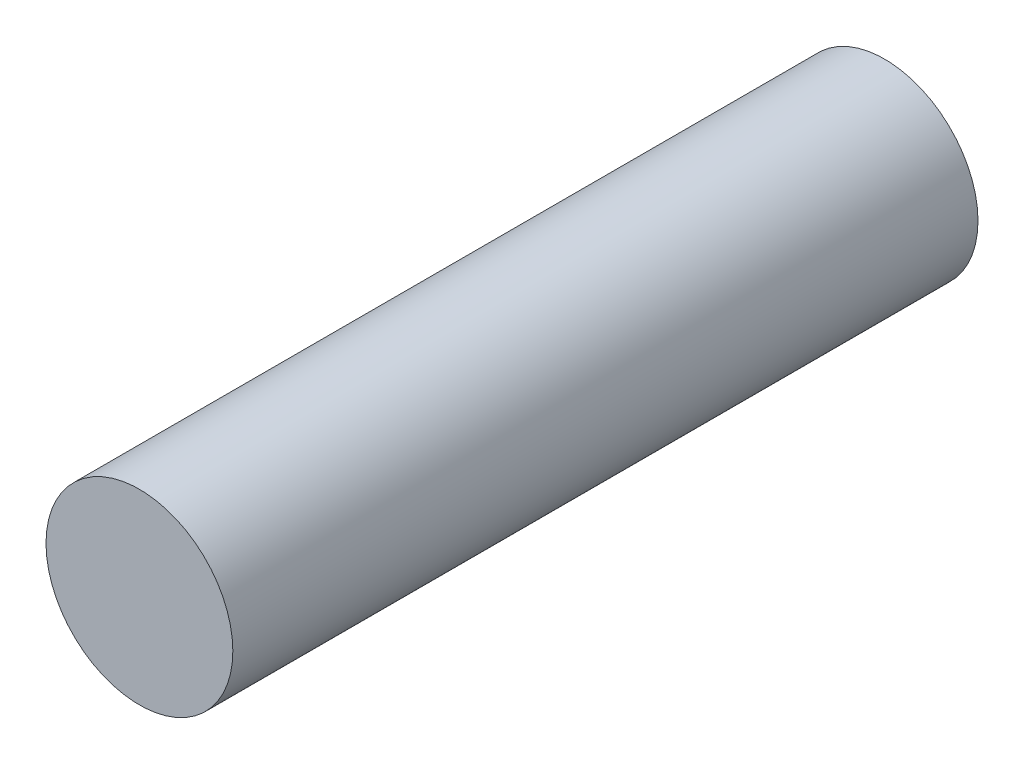
ISO-10303-21;
HEADER;
FILE_DESCRIPTION(('STEP AP214'),'2;1');
FILE_NAME('part.step','',(''),(''),'','','');
FILE_SCHEMA(('AUTOMOTIVE_DESIGN { 1 0 10303 214 1 1 1 1 }'));
ENDSEC;
DATA;
#1=APPLICATION_CONTEXT('core data for automotive mechanical design processes');
#2=APPLICATION_PROTOCOL_DEFINITION('international standard','automotive_design',2000,#1);
#3=PRODUCT_CONTEXT('',#1,'mechanical');
#4=PRODUCT('Part','Part','',(#3));
#5=PRODUCT_RELATED_PRODUCT_CATEGORY('part','',(#4));
#6=PRODUCT_DEFINITION_FORMATION('','',#4);
#7=PRODUCT_DEFINITION_CONTEXT('part definition',#1,'design');
#8=PRODUCT_DEFINITION('design','',#6,#7);
#9=PRODUCT_DEFINITION_SHAPE('','',#8);
#10=(LENGTH_UNIT() NAMED_UNIT(*) SI_UNIT(.MILLI.,.METRE.));
#11=(NAMED_UNIT(*) PLANE_ANGLE_UNIT() SI_UNIT($,.RADIAN.));
#12=(NAMED_UNIT(*) SI_UNIT($,.STERADIAN.) SOLID_ANGLE_UNIT());
#13=UNCERTAINTY_MEASURE_WITH_UNIT(LENGTH_MEASURE(1.E-05),#10,'distance_accuracy_value','');
#14=(GEOMETRIC_REPRESENTATION_CONTEXT(3) GLOBAL_UNCERTAINTY_ASSIGNED_CONTEXT((#13)) GLOBAL_UNIT_ASSIGNED_CONTEXT((#10,
#11,#12)) REPRESENTATION_CONTEXT('',''));
#15=CARTESIAN_POINT('',(0.,0.,0.));
#16=DIRECTION('',(0.,0.,1.));
#17=DIRECTION('',(1.,0.,0.));
#18=AXIS2_PLACEMENT_3D('',#15,#16,#17);
#19=CARTESIAN_POINT('',(0.,0.,-51.1175));
#20=DIRECTION('',(0.,0.,1.));
#21=DIRECTION('',(1.,0.,0.));
#22=AXIS2_PLACEMENT_3D('',#19,#20,#21);
#23=CYLINDRICAL_SURFACE('',#22,16.1764360782303);
#24=CARTESIAN_POINT('',(0.,0.,-51.1175));
#25=DIRECTION('',(0.,0.,1.));
#26=DIRECTION('',(1.,0.,0.));
#27=AXIS2_PLACEMENT_3D('',#24,#25,#26);
#28=CIRCLE('',#27,16.1764360782303);
#29=CARTESIAN_POINT('',(16.1764360782303,0.,-51.1175));
#30=VERTEX_POINT('',#29);
#31=EDGE_CURVE('E10',#30,#30,#28,.T.);
#32=ORIENTED_EDGE('',*,*,#31,.T.);
#33=EDGE_LOOP('',(#32));
#34=FACE_BOUND('',#33,.T.);
#35=CARTESIAN_POINT('',(0.,0.,77.9144999999999));
#36=DIRECTION('',(0.,0.,1.));
#37=DIRECTION('',(1.,0.,0.));
#38=AXIS2_PLACEMENT_3D('',#35,#36,#37);
#39=CIRCLE('',#38,16.1764360782303);
#40=CARTESIAN_POINT('',(16.1764360782303,0.,77.9144999999999));
#41=VERTEX_POINT('',#40);
#42=EDGE_CURVE('E37',#41,#41,#39,.T.);
#43=ORIENTED_EDGE('',*,*,#42,.F.);
#44=EDGE_LOOP('',(#43));
#45=FACE_BOUND('',#44,.T.);
#46=ADVANCED_FACE('F31',(#34,#45),#23,.T.);
#47=CARTESIAN_POINT('',(0.,0.,-51.1175));
#48=DIRECTION('',(0.,0.,1.));
#49=DIRECTION('',(1.,0.,0.));
#50=AXIS2_PLACEMENT_3D('',#47,#48,#49);
#51=PLANE('',#50);
#52=ORIENTED_EDGE('',*,*,#31,.F.);
#53=EDGE_LOOP('',(#52));
#54=FACE_BOUND('',#53,.T.);
#55=ADVANCED_FACE('F46',(#54),#51,.F.);
#56=CARTESIAN_POINT('',(0.,0.,77.9144999999999));
#57=DIRECTION('',(0.,0.,1.));
#58=DIRECTION('',(1.,0.,0.));
#59=AXIS2_PLACEMENT_3D('',#56,#57,#58);
#60=PLANE('',#59);
#61=ORIENTED_EDGE('',*,*,#42,.T.);
#62=EDGE_LOOP('',(#61));
#63=FACE_BOUND('',#62,.T.);
#64=ADVANCED_FACE('F43',(#63),#60,.T.);
#65=CLOSED_SHELL('',(#46,#55,#64));
#66=MANIFOLD_SOLID_BREP('B2',#65);
#67=ADVANCED_BREP_SHAPE_REPRESENTATION('',(#18,#66),#14);
#68=SHAPE_DEFINITION_REPRESENTATION(#9,#67);
ENDSEC;
END-ISO-10303-21;
